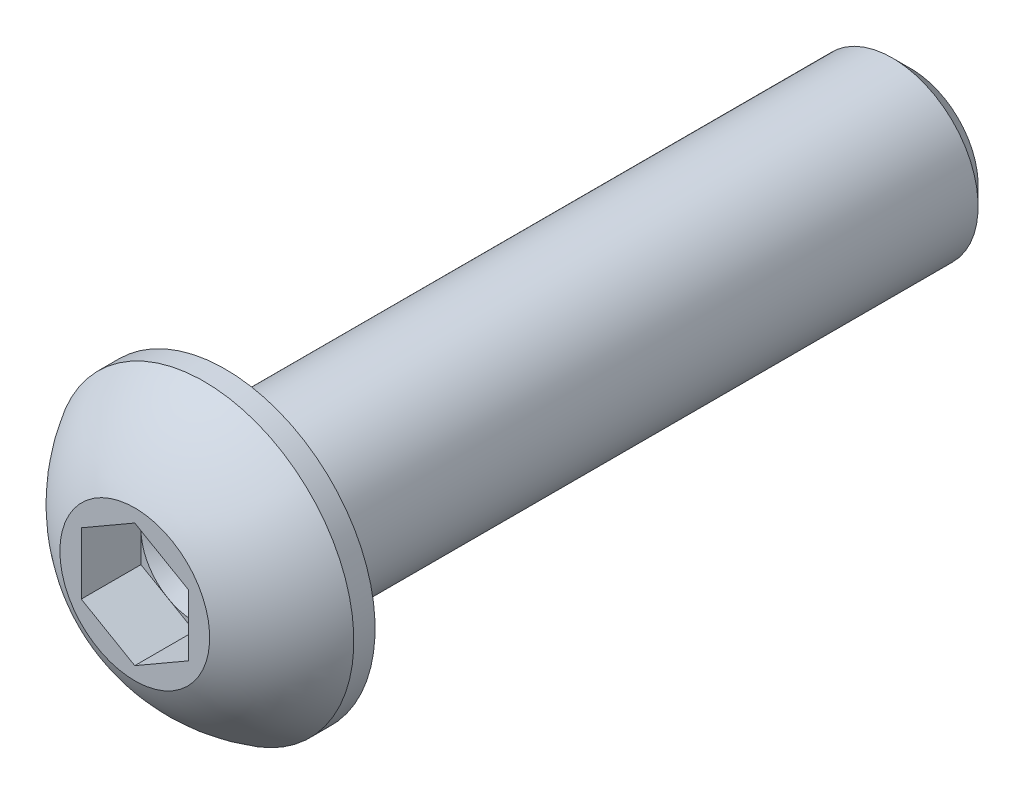
ISO-10303-21;
HEADER;
FILE_DESCRIPTION(('STEP AP214'),'2;1');
FILE_NAME('part.step','',(''),(''),'','','');
FILE_SCHEMA(('AUTOMOTIVE_DESIGN { 1 0 10303 214 1 1 1 1 }'));
ENDSEC;
DATA;
#1=APPLICATION_CONTEXT('core data for automotive mechanical design processes');
#2=APPLICATION_PROTOCOL_DEFINITION('international standard','automotive_design',2000,#1);
#3=PRODUCT_CONTEXT('',#1,'mechanical');
#4=PRODUCT('Part','Part','',(#3));
#5=PRODUCT_RELATED_PRODUCT_CATEGORY('part','',(#4));
#6=PRODUCT_DEFINITION_FORMATION('','',#4);
#7=PRODUCT_DEFINITION_CONTEXT('part definition',#1,'design');
#8=PRODUCT_DEFINITION('design','',#6,#7);
#9=PRODUCT_DEFINITION_SHAPE('','',#8);
#10=(LENGTH_UNIT() NAMED_UNIT(*) SI_UNIT(.MILLI.,.METRE.));
#11=(NAMED_UNIT(*) PLANE_ANGLE_UNIT() SI_UNIT($,.RADIAN.));
#12=(NAMED_UNIT(*) SI_UNIT($,.STERADIAN.) SOLID_ANGLE_UNIT());
#13=UNCERTAINTY_MEASURE_WITH_UNIT(LENGTH_MEASURE(1.E-05),#10,'distance_accuracy_value','');
#14=(GEOMETRIC_REPRESENTATION_CONTEXT(3) GLOBAL_UNCERTAINTY_ASSIGNED_CONTEXT((#13)) GLOBAL_UNIT_ASSIGNED_CONTEXT((#10,
#11,#12)) REPRESENTATION_CONTEXT('',''));
#15=CARTESIAN_POINT('',(0.,0.,0.));
#16=DIRECTION('',(0.,0.,1.));
#17=DIRECTION('',(1.,0.,0.));
#18=AXIS2_PLACEMENT_3D('',#15,#16,#17);
#19=CARTESIAN_POINT('',(0.,0.,-2.2098));
#20=DIRECTION('',(0.,0.,1.));
#21=DIRECTION('',(1.,0.,0.));
#22=AXIS2_PLACEMENT_3D('',#19,#20,#21);
#23=PLANE('',#22);
#24=CARTESIAN_POINT('',(0.,0.,-2.2098));
#25=DIRECTION('',(0.,0.,1.));
#26=DIRECTION('',(1.,0.,0.));
#27=AXIS2_PLACEMENT_3D('',#24,#25,#26);
#28=CIRCLE('',#27,1.9812);
#29=CARTESIAN_POINT('',(1.9812,0.,-2.2098));
#30=VERTEX_POINT('',#29);
#31=CARTESIAN_POINT('',(0.9906,1.71576952997773,-2.2098));
#32=VERTEX_POINT('',#31);
#33=EDGE_CURVE('E95',#30,#32,#28,.T.);
#34=ORIENTED_EDGE('',*,*,#33,.F.);
#35=DIRECTION('',(0.,-1.,0.));
#36=VECTOR('',#35,1.);
#37=CARTESIAN_POINT('',(1.9812,0.,-2.2098));
#38=LINE('',#37,#36);
#39=CARTESIAN_POINT('',(1.9812,1.14384635331849,-2.2098));
#40=VERTEX_POINT('',#39);
#41=EDGE_CURVE('E117',#40,#30,#38,.T.);
#42=ORIENTED_EDGE('',*,*,#41,.F.);
#43=DIRECTION('',(0.866025403784438,-0.5,0.));
#44=VECTOR('',#43,1.);
#45=CARTESIAN_POINT('',(0.9906,1.71576952997773,-2.2098));
#46=LINE('',#45,#44);
#47=EDGE_CURVE('E115',#32,#40,#46,.T.);
#48=ORIENTED_EDGE('',*,*,#47,.F.);
#49=EDGE_LOOP('',(#34,#42,#48));
#50=FACE_BOUND('',#49,.T.);
#51=ADVANCED_FACE('F17',(#50),#23,.T.);
#52=CARTESIAN_POINT('',(-0.9906,1.71576952997773,-2.2098));
#53=VERTEX_POINT('',#52);
#54=EDGE_CURVE('E97',#32,#53,#28,.T.);
#55=ORIENTED_EDGE('',*,*,#54,.F.);
#56=CARTESIAN_POINT('',(0.,2.28769270663697,-2.2098));
#57=VERTEX_POINT('',#56);
#58=EDGE_CURVE('E111',#57,#32,#46,.T.);
#59=ORIENTED_EDGE('',*,*,#58,.F.);
#60=DIRECTION('',(0.866025403784438,0.5,0.));
#61=VECTOR('',#60,1.);
#62=CARTESIAN_POINT('',(-0.9906,1.71576952997773,-2.2098));
#63=LINE('',#62,#61);
#64=EDGE_CURVE('E112',#53,#57,#63,.T.);
#65=ORIENTED_EDGE('',*,*,#64,.F.);
#66=EDGE_LOOP('',(#55,#59,#65));
#67=FACE_BOUND('',#66,.T.);
#68=ADVANCED_FACE('F109',(#67),#23,.T.);
#69=CARTESIAN_POINT('',(-1.9812,0.,-2.2098));
#70=VERTEX_POINT('',#69);
#71=EDGE_CURVE('E114',#53,#70,#28,.T.);
#72=ORIENTED_EDGE('',*,*,#71,.F.);
#73=CARTESIAN_POINT('',(-1.9812,1.14384635331848,-2.2098));
#74=VERTEX_POINT('',#73);
#75=EDGE_CURVE('E126',#74,#53,#63,.T.);
#76=ORIENTED_EDGE('',*,*,#75,.F.);
#77=DIRECTION('',(0.,1.,0.));
#78=VECTOR('',#77,1.);
#79=CARTESIAN_POINT('',(-1.9812,0.,-2.2098));
#80=LINE('',#79,#78);
#81=EDGE_CURVE('E129',#70,#74,#80,.T.);
#82=ORIENTED_EDGE('',*,*,#81,.F.);
#83=EDGE_LOOP('',(#72,#76,#82));
#84=FACE_BOUND('',#83,.T.);
#85=ADVANCED_FACE('F198',(#84),#23,.T.);
#86=CARTESIAN_POINT('',(-0.9906,-1.71576952997773,-2.2098));
#87=VERTEX_POINT('',#86);
#88=EDGE_CURVE('E224',#70,#87,#28,.T.);
#89=ORIENTED_EDGE('',*,*,#88,.F.);
#90=CARTESIAN_POINT('',(-1.9812,-1.14384635331849,-2.2098));
#91=VERTEX_POINT('',#90);
#92=EDGE_CURVE('E130',#91,#70,#80,.T.);
#93=ORIENTED_EDGE('',*,*,#92,.F.);
#94=DIRECTION('',(-0.866025403784439,0.5,0.));
#95=VECTOR('',#94,1.);
#96=CARTESIAN_POINT('',(-0.9906,-1.71576952997773,-2.2098));
#97=LINE('',#96,#95);
#98=EDGE_CURVE('E133',#87,#91,#97,.T.);
#99=ORIENTED_EDGE('',*,*,#98,.F.);
#100=EDGE_LOOP('',(#89,#93,#99));
#101=FACE_BOUND('',#100,.T.);
#102=ADVANCED_FACE('F211',(#101),#23,.T.);
#103=CARTESIAN_POINT('',(0.9906,-1.71576952997773,-2.2098));
#104=VERTEX_POINT('',#103);
#105=EDGE_CURVE('E32',#87,#104,#28,.T.);
#106=ORIENTED_EDGE('',*,*,#105,.F.);
#107=CARTESIAN_POINT('',(0.,-2.28769270663697,-2.2098));
#108=VERTEX_POINT('',#107);
#109=EDGE_CURVE('E134',#108,#87,#97,.T.);
#110=ORIENTED_EDGE('',*,*,#109,.F.);
#111=DIRECTION('',(-0.866025403784438,-0.5,0.));
#112=VECTOR('',#111,1.);
#113=CARTESIAN_POINT('',(0.9906,-1.71576952997773,-2.2098));
#114=LINE('',#113,#112);
#115=EDGE_CURVE('E137',#104,#108,#114,.T.);
#116=ORIENTED_EDGE('',*,*,#115,.F.);
#117=EDGE_LOOP('',(#106,#110,#116));
#118=FACE_BOUND('',#117,.T.);
#119=ADVANCED_FACE('F203',(#118),#23,.T.);
#120=CARTESIAN_POINT('',(-1.387475,0.,0.));
#121=DIRECTION('',(0.,0.,1.));
#122=DIRECTION('',(1.,0.,0.));
#123=AXIS2_PLACEMENT_3D('',#120,#121,#122);
#124=PLANE('',#123);
#125=CARTESIAN_POINT('',(0.,0.,0.));
#126=DIRECTION('',(0.,0.,-1.));
#127=DIRECTION('',(-1.,0.,0.));
#128=AXIS2_PLACEMENT_3D('',#125,#126,#127);
#129=CIRCLE('',#128,2.77495);
#130=CARTESIAN_POINT('',(-2.77495,0.,0.));
#131=VERTEX_POINT('',#130);
#132=EDGE_CURVE('E171',#131,#131,#129,.T.);
#133=ORIENTED_EDGE('',*,*,#132,.F.);
#134=EDGE_LOOP('',(#133));
#135=FACE_BOUND('',#134,.T.);
#136=DIRECTION('',(0.866025403784438,0.5,0.));
#137=VECTOR('',#136,1.);
#138=CARTESIAN_POINT('',(-0.9906,1.71576952997773,0.));
#139=LINE('',#138,#137);
#140=CARTESIAN_POINT('',(-1.9812,1.14384635331848,0.));
#141=VERTEX_POINT('',#140);
#142=CARTESIAN_POINT('',(0.,2.28769270663697,0.));
#143=VERTEX_POINT('',#142);
#144=EDGE_CURVE('E146',#141,#143,#139,.T.);
#145=ORIENTED_EDGE('',*,*,#144,.T.);
#146=DIRECTION('',(0.866025403784438,-0.5,0.));
#147=VECTOR('',#146,1.);
#148=CARTESIAN_POINT('',(0.9906,1.71576952997773,0.));
#149=LINE('',#148,#147);
#150=CARTESIAN_POINT('',(1.9812,1.14384635331849,0.));
#151=VERTEX_POINT('',#150);
#152=EDGE_CURVE('E104',#143,#151,#149,.T.);
#153=ORIENTED_EDGE('',*,*,#152,.T.);
#154=DIRECTION('',(0.,-1.,0.));
#155=VECTOR('',#154,1.);
#156=CARTESIAN_POINT('',(1.9812,0.,0.));
#157=LINE('',#156,#155);
#158=CARTESIAN_POINT('',(1.9812,-1.14384635331849,0.));
#159=VERTEX_POINT('',#158);
#160=EDGE_CURVE('E120',#151,#159,#157,.T.);
#161=ORIENTED_EDGE('',*,*,#160,.T.);
#162=DIRECTION('',(-0.866025403784438,-0.5,0.));
#163=VECTOR('',#162,1.);
#164=CARTESIAN_POINT('',(0.9906,-1.71576952997773,0.));
#165=LINE('',#164,#163);
#166=CARTESIAN_POINT('',(0.,-2.28769270663697,0.));
#167=VERTEX_POINT('',#166);
#168=EDGE_CURVE('E40',#159,#167,#165,.T.);
#169=ORIENTED_EDGE('',*,*,#168,.T.);
#170=DIRECTION('',(-0.866025403784439,0.5,0.));
#171=VECTOR('',#170,1.);
#172=CARTESIAN_POINT('',(-0.9906,-1.71576952997773,0.));
#173=LINE('',#172,#171);
#174=CARTESIAN_POINT('',(-1.9812,-1.14384635331849,0.));
#175=VERTEX_POINT('',#174);
#176=EDGE_CURVE('E152',#167,#175,#173,.T.);
#177=ORIENTED_EDGE('',*,*,#176,.T.);
#178=DIRECTION('',(0.,1.,0.));
#179=VECTOR('',#178,1.);
#180=CARTESIAN_POINT('',(-1.9812,0.,0.));
#181=LINE('',#180,#179);
#182=EDGE_CURVE('E149',#175,#141,#181,.T.);
#183=ORIENTED_EDGE('',*,*,#182,.T.);
#184=EDGE_LOOP('',(#145,#153,#161,#169,#177,#183));
#185=FACE_BOUND('',#184,.T.);
#186=ADVANCED_FACE('F210',(#135,#185),#124,.T.);
#187=CARTESIAN_POINT('',(0.,0.,1.48381805047393));
#188=DIRECTION('',(0.,0.,-1.));
#189=DIRECTION('',(-1.,0.,0.));
#190=AXIS2_PLACEMENT_3D('',#187,#188,#189);
#191=CYLINDRICAL_SURFACE('',#190,5.5499);
#192=CARTESIAN_POINT('',(0.,0.,-2.5654));
#193=DIRECTION('',(0.,0.,-1.));
#194=DIRECTION('',(-1.,0.,0.));
#195=AXIS2_PLACEMENT_3D('',#192,#193,#194);
#196=CIRCLE('',#195,5.5499);
#197=CARTESIAN_POINT('',(-5.5499,0.,-2.5654));
#198=VERTEX_POINT('',#197);
#199=EDGE_CURVE('E168',#198,#198,#196,.T.);
#200=ORIENTED_EDGE('',*,*,#199,.T.);
#201=EDGE_LOOP('',(#200));
#202=FACE_BOUND('',#201,.T.);
#203=CARTESIAN_POINT('',(0.,0.,-3.3528));
#204=DIRECTION('',(0.,0.,-1.));
#205=DIRECTION('',(-1.,0.,0.));
#206=AXIS2_PLACEMENT_3D('',#203,#204,#205);
#207=CIRCLE('',#206,5.5499);
#208=CARTESIAN_POINT('',(-5.5499,0.,-3.3528));
#209=VERTEX_POINT('',#208);
#210=EDGE_CURVE('E180',#209,#209,#207,.T.);
#211=ORIENTED_EDGE('',*,*,#210,.F.);
#212=EDGE_LOOP('',(#211));
#213=FACE_BOUND('',#212,.T.);
#214=ADVANCED_FACE('F217',(#202,#213),#191,.T.);
#215=CARTESIAN_POINT('',(-4.61645,0.,-3.3528));
#216=DIRECTION('',(0.,0.,-1.));
#217=DIRECTION('',(-1.,0.,0.));
#218=AXIS2_PLACEMENT_3D('',#215,#216,#217);
#219=PLANE('',#218);
#220=ORIENTED_EDGE('',*,*,#210,.T.);
#221=EDGE_LOOP('',(#220));
#222=FACE_BOUND('',#221,.T.);
#223=CARTESIAN_POINT('',(0.,0.,-3.3528));
#224=DIRECTION('',(0.,0.,-1.));
#225=DIRECTION('',(-1.,0.,0.));
#226=AXIS2_PLACEMENT_3D('',#223,#224,#225);
#227=CIRCLE('',#226,3.683);
#228=CARTESIAN_POINT('',(-3.683,0.,-3.3528));
#229=VERTEX_POINT('',#228);
#230=EDGE_CURVE('E177',#229,#229,#227,.T.);
#231=ORIENTED_EDGE('',*,*,#230,.F.);
#232=EDGE_LOOP('',(#231));
#233=FACE_BOUND('',#232,.T.);
#234=ADVANCED_FACE('F270',(#222,#233),#219,.T.);
#235=CARTESIAN_POINT('',(0.,0.,-3.8608));
#236=DIRECTION('',(0.,0.,-1.));
#237=DIRECTION('',(-1.,0.,0.));
#238=AXIS2_PLACEMENT_3D('',#235,#236,#237);
#239=TOROIDAL_SURFACE('',#238,3.683,0.508);
#240=ORIENTED_EDGE('',*,*,#230,.T.);
#241=EDGE_LOOP('',(#240));
#242=FACE_BOUND('',#241,.T.);
#243=CARTESIAN_POINT('',(0.,0.,-3.8608));
#244=DIRECTION('',(0.,0.,-1.));
#245=DIRECTION('',(-1.,0.,0.));
#246=AXIS2_PLACEMENT_3D('',#243,#244,#245);
#247=CIRCLE('',#246,3.175);
#248=CARTESIAN_POINT('',(-3.175,0.,-3.8608));
#249=VERTEX_POINT('',#248);
#250=EDGE_CURVE('E174',#249,#249,#247,.T.);
#251=ORIENTED_EDGE('',*,*,#250,.F.);
#252=EDGE_LOOP('',(#251));
#253=FACE_BOUND('',#252,.T.);
#254=ADVANCED_FACE('F266',(#242,#253),#239,.F.);
#255=CARTESIAN_POINT('',(0.,0.,1.48381805047393));
#256=DIRECTION('',(0.,0.,-1.));
#257=DIRECTION('',(-1.,0.,0.));
#258=AXIS2_PLACEMENT_3D('',#255,#256,#257);
#259=CYLINDRICAL_SURFACE('',#258,3.175);
#260=CARTESIAN_POINT('',(0.,0.,-28.06539233875));
#261=DIRECTION('',(0.,0.,-1.));
#262=DIRECTION('',(-1.,0.,0.));
#263=AXIS2_PLACEMENT_3D('',#260,#261,#262);
#264=CIRCLE('',#263,3.175);
#265=CARTESIAN_POINT('',(-3.175,0.,-28.06539233875));
#266=VERTEX_POINT('',#265);
#267=EDGE_CURVE('E11',#266,#266,#264,.F.);
#268=ORIENTED_EDGE('',*,*,#267,.T.);
#269=EDGE_LOOP('',(#268));
#270=FACE_BOUND('',#269,.T.);
#271=ORIENTED_EDGE('',*,*,#250,.T.);
#272=EDGE_LOOP('',(#271));
#273=FACE_BOUND('',#272,.T.);
#274=ADVANCED_FACE('F263',(#270,#273),#259,.T.);
#275=CARTESIAN_POINT('',(-1.5875,0.,-28.7528));
#276=DIRECTION('',(0.,0.,-1.));
#277=DIRECTION('',(-1.,0.,0.));
#278=AXIS2_PLACEMENT_3D('',#275,#276,#277);
#279=PLANE('',#278);
#280=CARTESIAN_POINT('',(0.,0.,-28.7528));
#281=DIRECTION('',(0.,0.,-1.));
#282=DIRECTION('',(-1.,0.,0.));
#283=AXIS2_PLACEMENT_3D('',#280,#281,#282);
#284=CIRCLE('',#283,2.48759233875);
#285=CARTESIAN_POINT('',(-2.48759233875,0.,-28.7528));
#286=VERTEX_POINT('',#285);
#287=EDGE_CURVE('E25',#286,#286,#284,.T.);
#288=ORIENTED_EDGE('',*,*,#287,.T.);
#289=EDGE_LOOP('',(#288));
#290=FACE_BOUND('',#289,.T.);
#291=ADVANCED_FACE('F185',(#290),#279,.T.);
#292=CARTESIAN_POINT('',(0.,0.,-5.78512506188119));
#293=DIRECTION('',(0.,0.,-1.));
#294=DIRECTION('',(-1.,0.,0.));
#295=AXIS2_PLACEMENT_3D('',#292,#293,#294);
#296=SPHERICAL_SURFACE('',#295,6.41623094067739);
#297=CARTESIAN_POINT('',(-5.5499,0.,-2.5654));
#298=CARTESIAN_POINT('',(-5.52984868712258,0.,-2.53083708566419));
#299=CARTESIAN_POINT('',(-5.50947442663449,0.,-2.49646152825914));
#300=CARTESIAN_POINT('',(-5.46808729773921,0.,-2.42809701945272));
#301=CARTESIAN_POINT('',(-5.44707442933201,0.,-2.39410806805135));
#302=CARTESIAN_POINT('',(-5.40441737190071,0.,-2.32652866339446));
#303=CARTESIAN_POINT('',(-5.38277318287662,0.,-2.29293821013895));
#304=CARTESIAN_POINT('',(-5.33886105159856,0.,-2.22616751866502));
#305=CARTESIAN_POINT('',(-5.3165931093446,0.,-2.19298728044662));
#306=CARTESIAN_POINT('',(-5.27144124070729,0.,-2.12704860244366));
#307=CARTESIAN_POINT('',(-5.24855731432393,0.,-2.09429016265911));
#308=CARTESIAN_POINT('',(-5.20218146582175,0.,-2.02920651509859));
#309=CARTESIAN_POINT('',(-5.17868954370293,0.,-1.99688130732261));
#310=CARTESIAN_POINT('',(-5.13110590319174,0.,-1.93267540683267));
#311=CARTESIAN_POINT('',(-5.10701418479939,0.,-1.90079471411871));
#312=CARTESIAN_POINT('',(-5.05823936086599,0.,-1.83748897146475));
#313=CARTESIAN_POINT('',(-5.03355625532495,0.,-1.80606392152474));
#314=CARTESIAN_POINT('',(-4.98360727255644,0.,-1.74368043314138));
#315=CARTESIAN_POINT('',(-4.95834139532897,0.,-1.71272199469802));
#316=CARTESIAN_POINT('',(-4.90723568808468,0.,-1.65128253514951));
#317=CARTESIAN_POINT('',(-4.88139585806785,0.,-1.62080151404435));
#318=CARTESIAN_POINT('',(-4.82915126447053,0.,-1.56032752837792));
#319=CARTESIAN_POINT('',(-4.80274650089003,0.,-1.53033456381665));
#320=CARTESIAN_POINT('',(-4.74938125657909,0.,-1.4708471600897));
#321=CARTESIAN_POINT('',(-4.72242077584865,0.,-1.44135272092403));
#322=CARTESIAN_POINT('',(-4.6679535076206,0.,-1.38287266283316));
#323=CARTESIAN_POINT('',(-4.640446720123,0.,-1.35388704390797));
#324=CARTESIAN_POINT('',(-4.58489643942842,0.,-1.29643474354243));
#325=CARTESIAN_POINT('',(-4.55685294623144,0.,-1.26796806210209));
#326=CARTESIAN_POINT('',(-4.50023904253956,0.,-1.21156357281885));
#327=CARTESIAN_POINT('',(-4.47166863204465,0.,-1.18362576497595));
#328=CARTESIAN_POINT('',(-4.41401086607543,0.,-1.12828877440023));
#329=CARTESIAN_POINT('',(-4.38492351060113,0.,-1.10088959166741));
#330=CARTESIAN_POINT('',(-4.32624200742802,0.,-1.04663941482087));
#331=CARTESIAN_POINT('',(-4.2966478597292,0.,-1.01978842070714));
#332=CARTESIAN_POINT('',(-4.23696310175451,0.,-0.966643993266066));
#333=CARTESIAN_POINT('',(-4.20687249147863,0.,-0.940350559938718));
#334=CARTESIAN_POINT('',(-4.14620531128433,0.,-0.888330431624667));
#335=CARTESIAN_POINT('',(-4.11562874136591,0.,-0.862603736637964));
#336=CARTESIAN_POINT('',(-4.05400031444217,0.,-0.811726064743085));
#337=CARTESIAN_POINT('',(-4.02294845743685,0.,-0.786575087834908));
#338=CARTESIAN_POINT('',(-3.96038029479081,0.,-0.736857630884288));
#339=CARTESIAN_POINT('',(-3.9288639891501,0.,-0.712291150841845));
#340=CARTESIAN_POINT('',(-3.8653779297977,0.,-0.663751262394898));
#341=CARTESIAN_POINT('',(-3.833408176086,0.,-0.639777853990394));
#342=CARTESIAN_POINT('',(-3.76902637942894,0.,-0.592432476584126));
#343=CARTESIAN_POINT('',(-3.73661433648358,0.,-0.569060507582361));
#344=CARTESIAN_POINT('',(-3.67135927457556,0.,-0.522926166816145));
#345=CARTESIAN_POINT('',(-3.63851625561289,0.,-0.500163795051694));
#346=CARTESIAN_POINT('',(-3.57241070531295,0.,-0.455256593824862));
#347=CARTESIAN_POINT('',(-3.53914817397567,0.,-0.43311176436248));
#348=CARTESIAN_POINT('',(-3.47221520900886,0.,-0.389447377232277));
#349=CARTESIAN_POINT('',(-3.43854477537934,0.,-0.367927819564454));
#350=CARTESIAN_POINT('',(-3.37080775824281,0.,-0.325521487354904));
#351=CARTESIAN_POINT('',(-3.3367411747358,0.,-0.304634712813176));
#352=CARTESIAN_POINT('',(-3.26822374869429,0.,-0.263501236996925));
#353=CARTESIAN_POINT('',(-3.23377290615979,0.,-0.243254535722401));
#354=CARTESIAN_POINT('',(-3.16449898643303,0.,-0.20340827436818));
#355=CARTESIAN_POINT('',(-3.12967590924077,0.,-0.183808714288483));
#356=CARTESIAN_POINT('',(-3.05966967674635,0.,-0.145263572892658));
#357=CARTESIAN_POINT('',(-3.02448652144419,0.,-0.126317991576531));
#358=CARTESIAN_POINT('',(-2.95377240655615,0.,-0.0890874337230963));
#359=CARTESIAN_POINT('',(-2.91824144697028,0.,-0.0708024571857884));
#360=CARTESIAN_POINT('',(-2.84684415010637,0.,-0.0348994419493856));
#361=CARTESIAN_POINT('',(-2.81097781282834,0.,-0.0172814032502906));
#362=CARTESIAN_POINT('',(-2.77495,0.,0.));
#363=B_SPLINE_CURVE_WITH_KNOTS('',3,(#297,#298,#299,#300,#301,#302,#303,#304,#305,#306,#307,
#308,#309,#310,#311,#312,#313,#314,#315,#316,#317,#318,#319,#320,#321,#322,#323,#324,#325,#326,
#327,#328,#329,#330,#331,#332,#333,#334,#335,#336,#337,#338,#339,#340,#341,#342,#343,#344,#345,
#346,#347,#348,#349,#350,#351,#352,#353,#354,#355,#356,#357,#358,#359,#360,#361,#362),
.UNSPECIFIED.,.F.,.F.,(4,2,2,2,2,2,2,2,2,2,2,2,2,2,2,2,2,2,2,2,2,2,2,2,2,2,2,2,2,2,2,2,4),(0.,
0.119872570538485,0.239745141076968,0.359617711615453,0.479490282153937,0.599362852692422,
0.719235423230906,0.83910799376939,0.958980564307874,1.07885313484636,1.19872570538484,
1.31859827592333,1.43847084646181,1.5583434170003,1.67821598753878,1.79808855807726,
1.91796112861575,2.03783369915423,2.15770626969272,2.2775788402312,2.39745141076968,
2.51732398130817,2.63719655184665,2.75706912238514,2.87694169292362,2.99681426346211,
3.11668683400059,3.23655940453907,3.35643197507756,3.47630454561604,3.59617711615453,
3.71604968669301,3.8359222572315),.UNSPECIFIED.);
#364=EDGE_CURVE('BSEAM257',#198,#131,#363,.T.);
#365=ORIENTED_EDGE('',*,*,#199,.F.);
#366=ORIENTED_EDGE('',*,*,#132,.T.);
#367=ORIENTED_EDGE('',*,*,#364,.T.);
#368=ORIENTED_EDGE('',*,*,#364,.F.);
#369=EDGE_LOOP('',(#365,#367,#366,#368));
#370=FACE_BOUND('',#369,.T.);
#371=ADVANCED_FACE('F257',(#370),#296,.T.);
#372=CARTESIAN_POINT('',(0.9906,1.71576952997773,-2.2098));
#373=DIRECTION('',(-0.5,-0.866025403784438,0.));
#374=DIRECTION('',(0.866025403784439,-0.5,0.));
#375=AXIS2_PLACEMENT_3D('',#372,#373,#374);
#376=PLANE('',#375);
#377=ORIENTED_EDGE('',*,*,#152,.F.);
#378=DIRECTION('',(0.,0.,1.));
#379=VECTOR('',#378,1.);
#380=CARTESIAN_POINT('',(0.,2.28769270663697,-2.2098));
#381=LINE('',#380,#379);
#382=EDGE_CURVE('E125',#57,#143,#381,.T.);
#383=ORIENTED_EDGE('',*,*,#382,.F.);
#384=ORIENTED_EDGE('',*,*,#58,.T.);
#385=ORIENTED_EDGE('',*,*,#47,.T.);
#386=DIRECTION('',(0.,0.,1.));
#387=VECTOR('',#386,1.);
#388=CARTESIAN_POINT('',(1.9812,1.14384635331849,-2.2098));
#389=LINE('',#388,#387);
#390=EDGE_CURVE('E143',#40,#151,#389,.T.);
#391=ORIENTED_EDGE('',*,*,#390,.T.);
#392=EDGE_LOOP('',(#377,#383,#384,#385,#391));
#393=FACE_BOUND('',#392,.T.);
#394=ADVANCED_FACE('F124',(#393),#376,.T.);
#395=CARTESIAN_POINT('',(-0.9906,1.71576952997773,-2.2098));
#396=DIRECTION('',(0.5,-0.866025403784438,0.));
#397=DIRECTION('',(0.866025403784438,0.5,0.));
#398=AXIS2_PLACEMENT_3D('',#395,#396,#397);
#399=PLANE('',#398);
#400=ORIENTED_EDGE('',*,*,#144,.F.);
#401=DIRECTION('',(0.,0.,1.));
#402=VECTOR('',#401,1.);
#403=CARTESIAN_POINT('',(-1.9812,1.14384635331848,-2.2098));
#404=LINE('',#403,#402);
#405=EDGE_CURVE('E165',#74,#141,#404,.T.);
#406=ORIENTED_EDGE('',*,*,#405,.F.);
#407=ORIENTED_EDGE('',*,*,#75,.T.);
#408=ORIENTED_EDGE('',*,*,#64,.T.);
#409=ORIENTED_EDGE('',*,*,#382,.T.);
#410=EDGE_LOOP('',(#400,#406,#407,#408,#409));
#411=FACE_BOUND('',#410,.T.);
#412=ADVANCED_FACE('F240',(#411),#399,.T.);
#413=CARTESIAN_POINT('',(-1.9812,0.,-2.2098));
#414=DIRECTION('',(1.,0.,0.));
#415=DIRECTION('',(0.,0.,-1.));
#416=AXIS2_PLACEMENT_3D('',#413,#414,#415);
#417=PLANE('',#416);
#418=ORIENTED_EDGE('',*,*,#182,.F.);
#419=DIRECTION('',(0.,0.,1.));
#420=VECTOR('',#419,1.);
#421=CARTESIAN_POINT('',(-1.9812,-1.14384635331849,-2.2098));
#422=LINE('',#421,#420);
#423=EDGE_CURVE('E163',#91,#175,#422,.T.);
#424=ORIENTED_EDGE('',*,*,#423,.F.);
#425=ORIENTED_EDGE('',*,*,#92,.T.);
#426=ORIENTED_EDGE('',*,*,#81,.T.);
#427=ORIENTED_EDGE('',*,*,#405,.T.);
#428=EDGE_LOOP('',(#418,#424,#425,#426,#427));
#429=FACE_BOUND('',#428,.T.);
#430=ADVANCED_FACE('F244',(#429),#417,.T.);
#431=CARTESIAN_POINT('',(-0.9906,-1.71576952997773,-2.2098));
#432=DIRECTION('',(0.5,0.866025403784438,0.));
#433=DIRECTION('',(-0.866025403784438,0.5,0.));
#434=AXIS2_PLACEMENT_3D('',#431,#432,#433);
#435=PLANE('',#434);
#436=ORIENTED_EDGE('',*,*,#176,.F.);
#437=DIRECTION('',(0.,0.,1.));
#438=VECTOR('',#437,1.);
#439=CARTESIAN_POINT('',(0.,-2.28769270663697,-2.2098));
#440=LINE('',#439,#438);
#441=EDGE_CURVE('E161',#108,#167,#440,.T.);
#442=ORIENTED_EDGE('',*,*,#441,.F.);
#443=ORIENTED_EDGE('',*,*,#109,.T.);
#444=ORIENTED_EDGE('',*,*,#98,.T.);
#445=ORIENTED_EDGE('',*,*,#423,.T.);
#446=EDGE_LOOP('',(#436,#442,#443,#444,#445));
#447=FACE_BOUND('',#446,.T.);
#448=ADVANCED_FACE('F232',(#447),#435,.T.);
#449=CARTESIAN_POINT('',(0.9906,-1.71576952997773,-2.2098));
#450=DIRECTION('',(-0.5,0.866025403784438,0.));
#451=DIRECTION('',(-0.866025403784438,-0.5,0.));
#452=AXIS2_PLACEMENT_3D('',#449,#450,#451);
#453=PLANE('',#452);
#454=ORIENTED_EDGE('',*,*,#168,.F.);
#455=DIRECTION('',(0.,0.,1.));
#456=VECTOR('',#455,1.);
#457=CARTESIAN_POINT('',(1.9812,-1.14384635331849,-2.2098));
#458=LINE('',#457,#456);
#459=CARTESIAN_POINT('',(1.9812,-1.14384635331849,-2.2098));
#460=VERTEX_POINT('',#459);
#461=EDGE_CURVE('E159',#460,#159,#458,.T.);
#462=ORIENTED_EDGE('',*,*,#461,.F.);
#463=EDGE_CURVE('E138',#460,#104,#114,.T.);
#464=ORIENTED_EDGE('',*,*,#463,.T.);
#465=ORIENTED_EDGE('',*,*,#115,.T.);
#466=ORIENTED_EDGE('',*,*,#441,.T.);
#467=EDGE_LOOP('',(#454,#462,#464,#465,#466));
#468=FACE_BOUND('',#467,.T.);
#469=ADVANCED_FACE('F207',(#468),#453,.T.);
#470=CARTESIAN_POINT('',(1.9812,0.,-2.2098));
#471=DIRECTION('',(-1.,0.,0.));
#472=DIRECTION('',(0.,0.,1.));
#473=AXIS2_PLACEMENT_3D('',#470,#471,#472);
#474=PLANE('',#473);
#475=ORIENTED_EDGE('',*,*,#160,.F.);
#476=ORIENTED_EDGE('',*,*,#390,.F.);
#477=ORIENTED_EDGE('',*,*,#41,.T.);
#478=EDGE_CURVE('E141',#30,#460,#38,.T.);
#479=ORIENTED_EDGE('',*,*,#478,.T.);
#480=ORIENTED_EDGE('',*,*,#461,.T.);
#481=EDGE_LOOP('',(#475,#476,#477,#479,#480));
#482=FACE_BOUND('',#481,.T.);
#483=ADVANCED_FACE('F201',(#482),#474,.T.);
#484=EDGE_CURVE('E99',#104,#30,#28,.T.);
#485=ORIENTED_EDGE('',*,*,#484,.F.);
#486=ORIENTED_EDGE('',*,*,#463,.F.);
#487=ORIENTED_EDGE('',*,*,#478,.F.);
#488=EDGE_LOOP('',(#485,#486,#487));
#489=FACE_BOUND('',#488,.T.);
#490=ADVANCED_FACE('F92',(#489),#23,.T.);
#491=CARTESIAN_POINT('',(0.,0.,-2.2098));
#492=DIRECTION('',(0.,0.,1.));
#493=DIRECTION('',(1.,0.,0.));
#494=AXIS2_PLACEMENT_3D('',#491,#492,#493);
#495=CONICAL_SURFACE('',#494,1.9812,1.0471975511966);
#496=CARTESIAN_POINT('',(0.,0.,-3.35364635331849));
#497=VERTEX_POINT('',#496);
#498=VERTEX_LOOP('',#497);
#499=FACE_BOUND('',#498,.T.);
#500=ORIENTED_EDGE('',*,*,#33,.T.);
#501=ORIENTED_EDGE('',*,*,#54,.T.);
#502=ORIENTED_EDGE('',*,*,#71,.T.);
#503=ORIENTED_EDGE('',*,*,#88,.T.);
#504=ORIENTED_EDGE('',*,*,#105,.T.);
#505=ORIENTED_EDGE('',*,*,#484,.T.);
#506=EDGE_LOOP('',(#500,#501,#502,#503,#504,#505));
#507=FACE_BOUND('',#506,.T.);
#508=ADVANCED_FACE('F90',(#499,#507),#495,.F.);
#509=CARTESIAN_POINT('',(0.,0.,-28.7528));
#510=DIRECTION('',(0.,0.,1.));
#511=DIRECTION('',(1.,0.,0.));
#512=AXIS2_PLACEMENT_3D('',#509,#510,#511);
#513=CONICAL_SURFACE('',#512,2.48759233875,0.785398163397448);
#514=ORIENTED_EDGE('',*,*,#267,.F.);
#515=EDGE_LOOP('',(#514));
#516=FACE_BOUND('',#515,.T.);
#517=ORIENTED_EDGE('',*,*,#287,.F.);
#518=EDGE_LOOP('',(#517));
#519=FACE_BOUND('',#518,.T.);
#520=ADVANCED_FACE('F19',(#516,#519),#513,.T.);
#521=CLOSED_SHELL('',(#51,#68,#85,#102,#119,#186,#214,#234,#254,#274,#291,#371,#394,#412,#430,
#448,#469,#483,#490,#508,#520));
#522=MANIFOLD_SOLID_BREP('B1',#521);
#523=ADVANCED_BREP_SHAPE_REPRESENTATION('',(#18,#522),#14);
#524=SHAPE_DEFINITION_REPRESENTATION(#9,#523);
ENDSEC;
END-ISO-10303-21;
